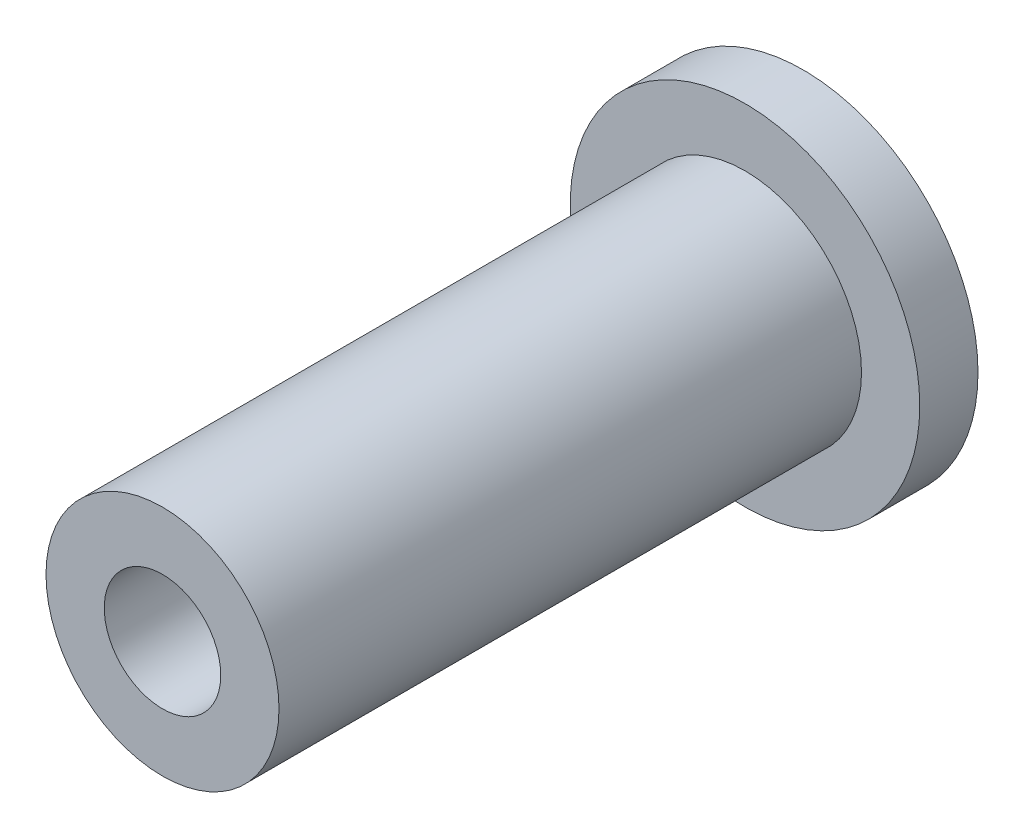
ISO-10303-21;
HEADER;
FILE_DESCRIPTION(('STEP AP214'),'2;1');
FILE_NAME('part.step','',(''),(''),'','','');
FILE_SCHEMA(('AUTOMOTIVE_DESIGN { 1 0 10303 214 1 1 1 1 }'));
ENDSEC;
DATA;
#1=APPLICATION_CONTEXT('core data for automotive mechanical design processes');
#2=APPLICATION_PROTOCOL_DEFINITION('international standard','automotive_design',2000,#1);
#3=PRODUCT_CONTEXT('',#1,'mechanical');
#4=PRODUCT('Part','Part','',(#3));
#5=PRODUCT_RELATED_PRODUCT_CATEGORY('part','',(#4));
#6=PRODUCT_DEFINITION_FORMATION('','',#4);
#7=PRODUCT_DEFINITION_CONTEXT('part definition',#1,'design');
#8=PRODUCT_DEFINITION('design','',#6,#7);
#9=PRODUCT_DEFINITION_SHAPE('','',#8);
#10=(LENGTH_UNIT() NAMED_UNIT(*) SI_UNIT(.MILLI.,.METRE.));
#11=(NAMED_UNIT(*) PLANE_ANGLE_UNIT() SI_UNIT($,.RADIAN.));
#12=(NAMED_UNIT(*) SI_UNIT($,.STERADIAN.) SOLID_ANGLE_UNIT());
#13=UNCERTAINTY_MEASURE_WITH_UNIT(LENGTH_MEASURE(1.E-05),#10,'distance_accuracy_value','');
#14=(GEOMETRIC_REPRESENTATION_CONTEXT(3) GLOBAL_UNCERTAINTY_ASSIGNED_CONTEXT((#13)) GLOBAL_UNIT_ASSIGNED_CONTEXT((#10,
#11,#12)) REPRESENTATION_CONTEXT('',''));
#15=CARTESIAN_POINT('',(0.,0.,0.));
#16=DIRECTION('',(0.,0.,1.));
#17=DIRECTION('',(1.,0.,0.));
#18=AXIS2_PLACEMENT_3D('',#15,#16,#17);
#19=CARTESIAN_POINT('',(0.,0.,110.));
#20=DIRECTION('',(0.,0.,1.));
#21=DIRECTION('',(1.,0.,0.));
#22=AXIS2_PLACEMENT_3D('',#19,#20,#21);
#23=PLANE('',#22);
#24=CARTESIAN_POINT('',(0.,0.,110.));
#25=DIRECTION('',(0.,0.,1.));
#26=DIRECTION('',(1.,0.,0.));
#27=AXIS2_PLACEMENT_3D('',#24,#25,#26);
#28=CIRCLE('',#27,20.);
#29=CARTESIAN_POINT('',(20.,0.,110.));
#30=VERTEX_POINT('',#29);
#31=EDGE_CURVE('E10',#30,#30,#28,.T.);
#32=ORIENTED_EDGE('',*,*,#31,.T.);
#33=EDGE_LOOP('',(#32));
#34=FACE_BOUND('',#33,.T.);
#35=CARTESIAN_POINT('',(0.,0.,110.));
#36=DIRECTION('',(0.,0.,1.));
#37=DIRECTION('',(1.,0.,0.));
#38=AXIS2_PLACEMENT_3D('',#35,#36,#37);
#39=CIRCLE('',#38,10.);
#40=CARTESIAN_POINT('',(10.,0.,110.));
#41=VERTEX_POINT('',#40);
#42=EDGE_CURVE('E44',#41,#41,#39,.T.);
#43=ORIENTED_EDGE('',*,*,#42,.F.);
#44=EDGE_LOOP('',(#43));
#45=FACE_BOUND('',#44,.T.);
#46=ADVANCED_FACE('F37',(#34,#45),#23,.T.);
#47=CARTESIAN_POINT('',(0.,0.,110.));
#48=DIRECTION('',(0.,0.,-1.));
#49=DIRECTION('',(-1.,0.,0.));
#50=AXIS2_PLACEMENT_3D('',#47,#48,#49);
#51=CYLINDRICAL_SURFACE('',#50,20.);
#52=CARTESIAN_POINT('',(0.,0.,9.99999999999999));
#53=DIRECTION('',(0.,0.,1.));
#54=DIRECTION('',(1.,0.,0.));
#55=AXIS2_PLACEMENT_3D('',#52,#53,#54);
#56=CIRCLE('',#55,20.);
#57=CARTESIAN_POINT('',(20.,0.,9.99999999999999));
#58=VERTEX_POINT('',#57);
#59=EDGE_CURVE('E48',#58,#58,#56,.T.);
#60=ORIENTED_EDGE('',*,*,#59,.T.);
#61=EDGE_LOOP('',(#60));
#62=FACE_BOUND('',#61,.T.);
#63=ORIENTED_EDGE('',*,*,#31,.F.);
#64=EDGE_LOOP('',(#63));
#65=FACE_BOUND('',#64,.T.);
#66=ADVANCED_FACE('F39',(#62,#65),#51,.T.);
#67=CARTESIAN_POINT('',(0.,0.,110.));
#68=DIRECTION('',(0.,0.,-1.));
#69=DIRECTION('',(-1.,0.,0.));
#70=AXIS2_PLACEMENT_3D('',#67,#68,#69);
#71=CYLINDRICAL_SURFACE('',#70,10.);
#72=ORIENTED_EDGE('',*,*,#42,.T.);
#73=EDGE_LOOP('',(#72));
#74=FACE_BOUND('',#73,.T.);
#75=CARTESIAN_POINT('',(0.,0.,0.));
#76=DIRECTION('',(0.,0.,1.));
#77=DIRECTION('',(1.,0.,0.));
#78=AXIS2_PLACEMENT_3D('',#75,#76,#77);
#79=CIRCLE('',#78,10.);
#80=CARTESIAN_POINT('',(10.,0.,0.));
#81=VERTEX_POINT('',#80);
#82=EDGE_CURVE('E58',#81,#81,#79,.T.);
#83=ORIENTED_EDGE('',*,*,#82,.F.);
#84=EDGE_LOOP('',(#83));
#85=FACE_BOUND('',#84,.T.);
#86=ADVANCED_FACE('F67',(#74,#85),#71,.F.);
#87=CARTESIAN_POINT('',(0.,0.,10.));
#88=DIRECTION('',(0.,0.,-1.));
#89=DIRECTION('',(-1.,0.,0.));
#90=AXIS2_PLACEMENT_3D('',#87,#88,#89);
#91=CYLINDRICAL_SURFACE('',#90,30.);
#92=CARTESIAN_POINT('',(0.,0.,10.));
#93=DIRECTION('',(0.,0.,1.));
#94=DIRECTION('',(1.,0.,0.));
#95=AXIS2_PLACEMENT_3D('',#92,#93,#94);
#96=CIRCLE('',#95,30.);
#97=CARTESIAN_POINT('',(30.,0.,10.));
#98=VERTEX_POINT('',#97);
#99=EDGE_CURVE('E52',#98,#98,#96,.T.);
#100=ORIENTED_EDGE('',*,*,#99,.F.);
#101=EDGE_LOOP('',(#100));
#102=FACE_BOUND('',#101,.T.);
#103=CARTESIAN_POINT('',(0.,0.,0.));
#104=DIRECTION('',(0.,0.,1.));
#105=DIRECTION('',(1.,0.,0.));
#106=AXIS2_PLACEMENT_3D('',#103,#104,#105);
#107=CIRCLE('',#106,30.);
#108=CARTESIAN_POINT('',(30.,0.,0.));
#109=VERTEX_POINT('',#108);
#110=EDGE_CURVE('E55',#109,#109,#107,.T.);
#111=ORIENTED_EDGE('',*,*,#110,.T.);
#112=EDGE_LOOP('',(#111));
#113=FACE_BOUND('',#112,.T.);
#114=ADVANCED_FACE('F69',(#102,#113),#91,.T.);
#115=CARTESIAN_POINT('',(0.,0.,10.));
#116=DIRECTION('',(0.,0.,1.));
#117=DIRECTION('',(1.,0.,0.));
#118=AXIS2_PLACEMENT_3D('',#115,#116,#117);
#119=PLANE('',#118);
#120=ORIENTED_EDGE('',*,*,#59,.F.);
#121=EDGE_LOOP('',(#120));
#122=FACE_BOUND('',#121,.T.);
#123=ORIENTED_EDGE('',*,*,#99,.T.);
#124=EDGE_LOOP('',(#123));
#125=FACE_BOUND('',#124,.T.);
#126=ADVANCED_FACE('F76',(#122,#125),#119,.T.);
#127=CARTESIAN_POINT('',(0.,0.,0.));
#128=DIRECTION('',(0.,0.,1.));
#129=DIRECTION('',(1.,0.,0.));
#130=AXIS2_PLACEMENT_3D('',#127,#128,#129);
#131=PLANE('',#130);
#132=ORIENTED_EDGE('',*,*,#82,.T.);
#133=EDGE_LOOP('',(#132));
#134=FACE_BOUND('',#133,.T.);
#135=ORIENTED_EDGE('',*,*,#110,.F.);
#136=EDGE_LOOP('',(#135));
#137=FACE_BOUND('',#136,.T.);
#138=ADVANCED_FACE('F64',(#134,#137),#131,.F.);
#139=CLOSED_SHELL('',(#46,#66,#86,#114,#126,#138));
#140=MANIFOLD_SOLID_BREP('B2',#139);
#141=ADVANCED_BREP_SHAPE_REPRESENTATION('',(#18,#140),#14);
#142=SHAPE_DEFINITION_REPRESENTATION(#9,#141);
ENDSEC;
END-ISO-10303-21;
